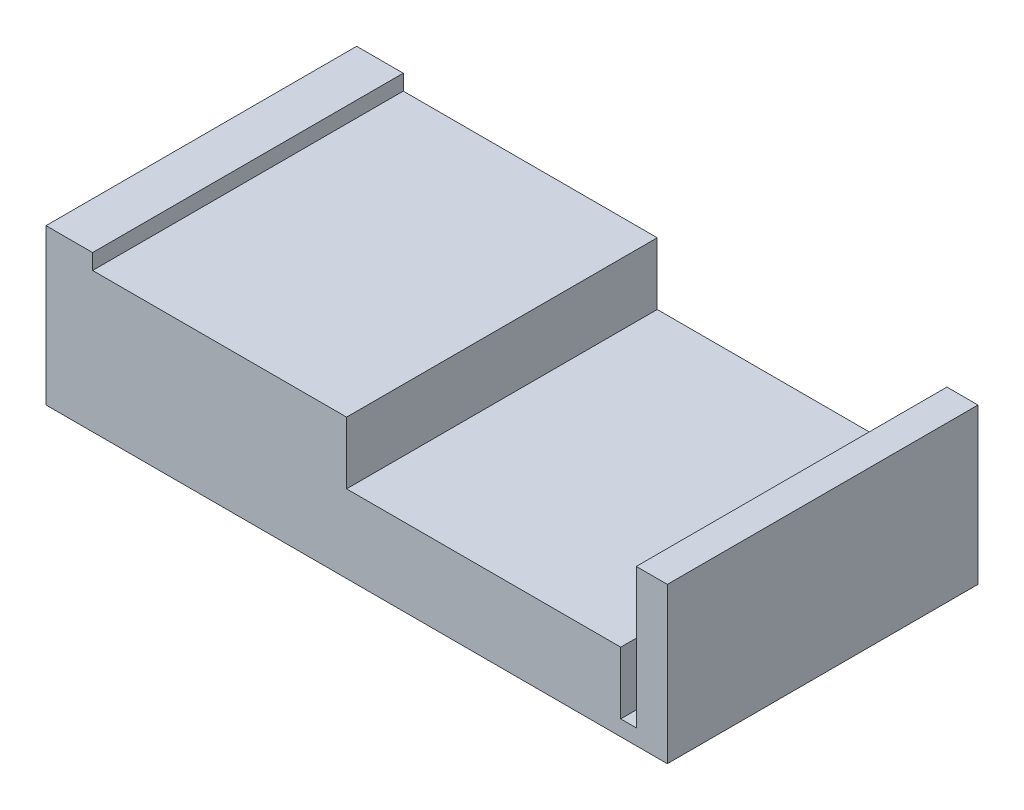
ISO-10303-21;
HEADER;
FILE_DESCRIPTION(('STEP AP214'),'2;1');
FILE_NAME('part.step','',(''),(''),'','','');
FILE_SCHEMA(('AUTOMOTIVE_DESIGN { 1 0 10303 214 1 1 1 1 }'));
ENDSEC;
DATA;
#1=APPLICATION_CONTEXT('core data for automotive mechanical design processes');
#2=APPLICATION_PROTOCOL_DEFINITION('international standard','automotive_design',2000,#1);
#3=PRODUCT_CONTEXT('',#1,'mechanical');
#4=PRODUCT('Part','Part','',(#3));
#5=PRODUCT_RELATED_PRODUCT_CATEGORY('part','',(#4));
#6=PRODUCT_DEFINITION_FORMATION('','',#4);
#7=PRODUCT_DEFINITION_CONTEXT('part definition',#1,'design');
#8=PRODUCT_DEFINITION('design','',#6,#7);
#9=PRODUCT_DEFINITION_SHAPE('','',#8);
#10=(LENGTH_UNIT() NAMED_UNIT(*) SI_UNIT(.MILLI.,.METRE.));
#11=(NAMED_UNIT(*) PLANE_ANGLE_UNIT() SI_UNIT($,.RADIAN.));
#12=(NAMED_UNIT(*) SI_UNIT($,.STERADIAN.) SOLID_ANGLE_UNIT());
#13=UNCERTAINTY_MEASURE_WITH_UNIT(LENGTH_MEASURE(1.E-05),#10,'distance_accuracy_value','');
#14=(GEOMETRIC_REPRESENTATION_CONTEXT(3) GLOBAL_UNCERTAINTY_ASSIGNED_CONTEXT((#13)) GLOBAL_UNIT_ASSIGNED_CONTEXT((#10,
#11,#12)) REPRESENTATION_CONTEXT('',''));
#15=CARTESIAN_POINT('',(0.,0.,0.));
#16=DIRECTION('',(0.,0.,1.));
#17=DIRECTION('',(1.,0.,0.));
#18=AXIS2_PLACEMENT_3D('',#15,#16,#17);
#19=CARTESIAN_POINT('',(0.,50.,0.));
#20=DIRECTION('',(0.,-1.,0.));
#21=DIRECTION('',(0.,0.,-1.));
#22=AXIS2_PLACEMENT_3D('',#19,#20,#21);
#23=PLANE('',#22);
#24=DIRECTION('',(1.,0.,0.));
#25=VECTOR('',#24,1.);
#26=CARTESIAN_POINT('',(0.,50.,0.));
#27=LINE('',#26,#25);
#28=CARTESIAN_POINT('',(0.,50.,0.));
#29=VERTEX_POINT('',#28);
#30=CARTESIAN_POINT('',(15.,50.,0.));
#31=VERTEX_POINT('',#30);
#32=EDGE_CURVE('E88',#29,#31,#27,.T.);
#33=ORIENTED_EDGE('',*,*,#32,.T.);
#34=DIRECTION('',(0.,0.,1.));
#35=VECTOR('',#34,1.);
#36=CARTESIAN_POINT('',(15.,50.,-100.));
#37=LINE('',#36,#35);
#38=CARTESIAN_POINT('',(15.,50.,-100.));
#39=VERTEX_POINT('',#38);
#40=EDGE_CURVE('E179',#39,#31,#37,.T.);
#41=ORIENTED_EDGE('',*,*,#40,.F.);
#42=DIRECTION('',(-1.,0.,0.));
#43=VECTOR('',#42,1.);
#44=CARTESIAN_POINT('',(0.,50.,-100.));
#45=LINE('',#44,#43);
#46=CARTESIAN_POINT('',(0.,50.,-100.));
#47=VERTEX_POINT('',#46);
#48=EDGE_CURVE('E59',#39,#47,#45,.T.);
#49=ORIENTED_EDGE('',*,*,#48,.T.);
#50=DIRECTION('',(0.,0.,1.));
#51=VECTOR('',#50,1.);
#52=CARTESIAN_POINT('',(0.,50.,0.));
#53=LINE('',#52,#51);
#54=EDGE_CURVE('E202',#47,#29,#53,.T.);
#55=ORIENTED_EDGE('',*,*,#54,.T.);
#56=EDGE_LOOP('',(#33,#41,#49,#55));
#57=FACE_BOUND('',#56,.T.);
#58=ADVANCED_FACE('F35',(#57),#23,.F.);
#59=CARTESIAN_POINT('',(0.,50.,0.));
#60=DIRECTION('',(1.,0.,0.));
#61=DIRECTION('',(0.,0.,-1.));
#62=AXIS2_PLACEMENT_3D('',#59,#60,#61);
#63=PLANE('',#62);
#64=DIRECTION('',(0.,0.,1.));
#65=VECTOR('',#64,1.);
#66=CARTESIAN_POINT('',(0.,0.,0.));
#67=LINE('',#66,#65);
#68=CARTESIAN_POINT('',(0.,0.,-100.));
#69=VERTEX_POINT('',#68);
#70=CARTESIAN_POINT('',(0.,0.,0.));
#71=VERTEX_POINT('',#70);
#72=EDGE_CURVE('E200',#69,#71,#67,.T.);
#73=ORIENTED_EDGE('',*,*,#72,.T.);
#74=DIRECTION('',(0.,-1.,0.));
#75=VECTOR('',#74,1.);
#76=CARTESIAN_POINT('',(0.,50.,0.));
#77=LINE('',#76,#75);
#78=EDGE_CURVE('E11',#29,#71,#77,.T.);
#79=ORIENTED_EDGE('',*,*,#78,.F.);
#80=ORIENTED_EDGE('',*,*,#54,.F.);
#81=DIRECTION('',(0.,-1.,0.));
#82=VECTOR('',#81,1.);
#83=CARTESIAN_POINT('',(0.,50.,-100.));
#84=LINE('',#83,#82);
#85=EDGE_CURVE('E210',#47,#69,#84,.T.);
#86=ORIENTED_EDGE('',*,*,#85,.T.);
#87=EDGE_LOOP('',(#73,#79,#80,#86));
#88=FACE_BOUND('',#87,.T.);
#89=ADVANCED_FACE('F37',(#88),#63,.F.);
#90=CARTESIAN_POINT('',(0.,50.,0.));
#91=DIRECTION('',(0.,0.,-1.));
#92=DIRECTION('',(-1.,0.,0.));
#93=AXIS2_PLACEMENT_3D('',#90,#91,#92);
#94=PLANE('',#93);
#95=DIRECTION('',(0.,1.,0.));
#96=VECTOR('',#95,1.);
#97=CARTESIAN_POINT('',(190.,25.,0.));
#98=LINE('',#97,#96);
#99=CARTESIAN_POINT('',(190.,5.,0.));
#100=VERTEX_POINT('',#99);
#101=CARTESIAN_POINT('',(190.,50.,0.));
#102=VERTEX_POINT('',#101);
#103=EDGE_CURVE('E146',#100,#102,#98,.T.);
#104=ORIENTED_EDGE('',*,*,#103,.F.);
#105=DIRECTION('',(1.,0.,0.));
#106=VECTOR('',#105,1.);
#107=CARTESIAN_POINT('',(190.,5.,0.));
#108=LINE('',#107,#106);
#109=CARTESIAN_POINT('',(185.,5.,0.));
#110=VERTEX_POINT('',#109);
#111=EDGE_CURVE('E154',#110,#100,#108,.T.);
#112=ORIENTED_EDGE('',*,*,#111,.F.);
#113=DIRECTION('',(0.,1.,0.));
#114=VECTOR('',#113,1.);
#115=CARTESIAN_POINT('',(185.,5.,0.));
#116=LINE('',#115,#114);
#117=CARTESIAN_POINT('',(185.,25.,0.));
#118=VERTEX_POINT('',#117);
#119=EDGE_CURVE('E165',#110,#118,#116,.T.);
#120=ORIENTED_EDGE('',*,*,#119,.T.);
#121=DIRECTION('',(1.,0.,0.));
#122=VECTOR('',#121,1.);
#123=CARTESIAN_POINT('',(96.7527416806416,25.,0.));
#124=LINE('',#123,#122);
#125=CARTESIAN_POINT('',(96.7527416806416,25.,0.));
#126=VERTEX_POINT('',#125);
#127=EDGE_CURVE('E172',#126,#118,#124,.T.);
#128=ORIENTED_EDGE('',*,*,#127,.F.);
#129=DIRECTION('',(0.,1.,0.));
#130=VECTOR('',#129,1.);
#131=CARTESIAN_POINT('',(96.7527416806416,25.,0.));
#132=LINE('',#131,#130);
#133=CARTESIAN_POINT('',(96.7527416806416,45.,0.));
#134=VERTEX_POINT('',#133);
#135=EDGE_CURVE('E177',#126,#134,#132,.T.);
#136=ORIENTED_EDGE('',*,*,#135,.T.);
#137=DIRECTION('',(1.,0.,0.));
#138=VECTOR('',#137,1.);
#139=CARTESIAN_POINT('',(15.,45.,0.));
#140=LINE('',#139,#138);
#141=CARTESIAN_POINT('',(15.,45.,0.));
#142=VERTEX_POINT('',#141);
#143=EDGE_CURVE('E187',#142,#134,#140,.T.);
#144=ORIENTED_EDGE('',*,*,#143,.F.);
#145=DIRECTION('',(0.,1.,0.));
#146=VECTOR('',#145,1.);
#147=CARTESIAN_POINT('',(15.,45.,0.));
#148=LINE('',#147,#146);
#149=EDGE_CURVE('E196',#142,#31,#148,.T.);
#150=ORIENTED_EDGE('',*,*,#149,.T.);
#151=ORIENTED_EDGE('',*,*,#32,.F.);
#152=ORIENTED_EDGE('',*,*,#78,.T.);
#153=DIRECTION('',(1.,0.,0.));
#154=VECTOR('',#153,1.);
#155=CARTESIAN_POINT('',(0.,0.,0.));
#156=LINE('',#155,#154);
#157=CARTESIAN_POINT('',(200.,0.,0.));
#158=VERTEX_POINT('',#157);
#159=EDGE_CURVE('E213',#71,#158,#156,.T.);
#160=ORIENTED_EDGE('',*,*,#159,.T.);
#161=DIRECTION('',(0.,-1.,0.));
#162=VECTOR('',#161,1.);
#163=CARTESIAN_POINT('',(200.,50.,0.));
#164=LINE('',#163,#162);
#165=CARTESIAN_POINT('',(200.,50.,0.));
#166=VERTEX_POINT('',#165);
#167=EDGE_CURVE('E43',#166,#158,#164,.T.);
#168=ORIENTED_EDGE('',*,*,#167,.F.);
#169=EDGE_CURVE('E204',#102,#166,#27,.T.);
#170=ORIENTED_EDGE('',*,*,#169,.F.);
#171=EDGE_LOOP('',(#104,#112,#120,#128,#136,#144,#150,#151,#152,#160,#168,#170));
#172=FACE_BOUND('',#171,.T.);
#173=ADVANCED_FACE('F245',(#172),#94,.F.);
#174=CARTESIAN_POINT('',(200.,50.,0.));
#175=DIRECTION('',(-1.,0.,0.));
#176=DIRECTION('',(0.,0.,1.));
#177=AXIS2_PLACEMENT_3D('',#174,#175,#176);
#178=PLANE('',#177);
#179=DIRECTION('',(0.,0.,-1.));
#180=VECTOR('',#179,1.);
#181=CARTESIAN_POINT('',(200.,0.,0.));
#182=LINE('',#181,#180);
#183=CARTESIAN_POINT('',(200.,0.,-100.));
#184=VERTEX_POINT('',#183);
#185=EDGE_CURVE('E215',#158,#184,#182,.T.);
#186=ORIENTED_EDGE('',*,*,#185,.T.);
#187=DIRECTION('',(0.,-1.,0.));
#188=VECTOR('',#187,1.);
#189=CARTESIAN_POINT('',(200.,50.,-100.));
#190=LINE('',#189,#188);
#191=CARTESIAN_POINT('',(200.,50.,-100.));
#192=VERTEX_POINT('',#191);
#193=EDGE_CURVE('E219',#192,#184,#190,.T.);
#194=ORIENTED_EDGE('',*,*,#193,.F.);
#195=DIRECTION('',(0.,0.,-1.));
#196=VECTOR('',#195,1.);
#197=CARTESIAN_POINT('',(200.,50.,0.));
#198=LINE('',#197,#196);
#199=EDGE_CURVE('E206',#166,#192,#198,.T.);
#200=ORIENTED_EDGE('',*,*,#199,.F.);
#201=ORIENTED_EDGE('',*,*,#167,.T.);
#202=EDGE_LOOP('',(#186,#194,#200,#201));
#203=FACE_BOUND('',#202,.T.);
#204=ADVANCED_FACE('F225',(#203),#178,.F.);
#205=CARTESIAN_POINT('',(0.,50.,-100.));
#206=DIRECTION('',(0.,0.,1.));
#207=DIRECTION('',(1.,0.,0.));
#208=AXIS2_PLACEMENT_3D('',#205,#206,#207);
#209=PLANE('',#208);
#210=DIRECTION('',(-1.,0.,0.));
#211=VECTOR('',#210,1.);
#212=CARTESIAN_POINT('',(190.,5.,-100.));
#213=LINE('',#212,#211);
#214=CARTESIAN_POINT('',(190.,5.,-100.));
#215=VERTEX_POINT('',#214);
#216=CARTESIAN_POINT('',(185.,5.,-100.));
#217=VERTEX_POINT('',#216);
#218=EDGE_CURVE('E152',#215,#217,#213,.T.);
#219=ORIENTED_EDGE('',*,*,#218,.F.);
#220=DIRECTION('',(0.,1.,0.));
#221=VECTOR('',#220,1.);
#222=CARTESIAN_POINT('',(190.,25.,-100.));
#223=LINE('',#222,#221);
#224=CARTESIAN_POINT('',(190.,50.,-100.));
#225=VERTEX_POINT('',#224);
#226=EDGE_CURVE('E135',#215,#225,#223,.T.);
#227=ORIENTED_EDGE('',*,*,#226,.T.);
#228=EDGE_CURVE('E208',#192,#225,#45,.T.);
#229=ORIENTED_EDGE('',*,*,#228,.F.);
#230=ORIENTED_EDGE('',*,*,#193,.T.);
#231=DIRECTION('',(-1.,0.,0.));
#232=VECTOR('',#231,1.);
#233=CARTESIAN_POINT('',(0.,0.,-100.));
#234=LINE('',#233,#232);
#235=EDGE_CURVE('E81',#184,#69,#234,.T.);
#236=ORIENTED_EDGE('',*,*,#235,.T.);
#237=ORIENTED_EDGE('',*,*,#85,.F.);
#238=ORIENTED_EDGE('',*,*,#48,.F.);
#239=DIRECTION('',(0.,1.,0.));
#240=VECTOR('',#239,1.);
#241=CARTESIAN_POINT('',(15.,45.,-100.));
#242=LINE('',#241,#240);
#243=CARTESIAN_POINT('',(15.,45.,-100.));
#244=VERTEX_POINT('',#243);
#245=EDGE_CURVE('E198',#244,#39,#242,.T.);
#246=ORIENTED_EDGE('',*,*,#245,.F.);
#247=DIRECTION('',(-1.,0.,0.));
#248=VECTOR('',#247,1.);
#249=CARTESIAN_POINT('',(15.,45.,-100.));
#250=LINE('',#249,#248);
#251=CARTESIAN_POINT('',(96.7527416806416,45.,-100.));
#252=VERTEX_POINT('',#251);
#253=EDGE_CURVE('E193',#252,#244,#250,.T.);
#254=ORIENTED_EDGE('',*,*,#253,.F.);
#255=DIRECTION('',(0.,1.,0.));
#256=VECTOR('',#255,1.);
#257=CARTESIAN_POINT('',(96.7527416806416,25.,-100.));
#258=LINE('',#257,#256);
#259=CARTESIAN_POINT('',(96.7527416806416,25.,-100.));
#260=VERTEX_POINT('',#259);
#261=EDGE_CURVE('E145',#260,#252,#258,.T.);
#262=ORIENTED_EDGE('',*,*,#261,.F.);
#263=DIRECTION('',(-1.,0.,0.));
#264=VECTOR('',#263,1.);
#265=CARTESIAN_POINT('',(96.7527416806416,25.,-100.));
#266=LINE('',#265,#264);
#267=CARTESIAN_POINT('',(185.,25.,-100.));
#268=VERTEX_POINT('',#267);
#269=EDGE_CURVE('E175',#268,#260,#266,.T.);
#270=ORIENTED_EDGE('',*,*,#269,.F.);
#271=DIRECTION('',(0.,1.,0.));
#272=VECTOR('',#271,1.);
#273=CARTESIAN_POINT('',(185.,5.,-100.));
#274=LINE('',#273,#272);
#275=EDGE_CURVE('E50',#217,#268,#274,.T.);
#276=ORIENTED_EDGE('',*,*,#275,.F.);
#277=EDGE_LOOP('',(#219,#227,#229,#230,#236,#237,#238,#246,#254,#262,#270,#276));
#278=FACE_BOUND('',#277,.T.);
#279=ADVANCED_FACE('F157',(#278),#209,.F.);
#280=ORIENTED_EDGE('',*,*,#228,.T.);
#281=DIRECTION('',(0.,0.,-1.));
#282=VECTOR('',#281,1.);
#283=CARTESIAN_POINT('',(190.,50.,-100.));
#284=LINE('',#283,#282);
#285=EDGE_CURVE('E141',#102,#225,#284,.T.);
#286=ORIENTED_EDGE('',*,*,#285,.F.);
#287=ORIENTED_EDGE('',*,*,#169,.T.);
#288=ORIENTED_EDGE('',*,*,#199,.T.);
#289=EDGE_LOOP('',(#280,#286,#287,#288));
#290=FACE_BOUND('',#289,.T.);
#291=ADVANCED_FACE('F241',(#290),#23,.F.);
#292=CARTESIAN_POINT('',(0.,0.,0.));
#293=DIRECTION('',(0.,-1.,0.));
#294=DIRECTION('',(0.,0.,-1.));
#295=AXIS2_PLACEMENT_3D('',#292,#293,#294);
#296=PLANE('',#295);
#297=ORIENTED_EDGE('',*,*,#72,.F.);
#298=ORIENTED_EDGE('',*,*,#235,.F.);
#299=ORIENTED_EDGE('',*,*,#185,.F.);
#300=ORIENTED_EDGE('',*,*,#159,.F.);
#301=EDGE_LOOP('',(#297,#298,#299,#300));
#302=FACE_BOUND('',#301,.T.);
#303=ADVANCED_FACE('F230',(#302),#296,.T.);
#304=CARTESIAN_POINT('',(15.,45.,-100.));
#305=DIRECTION('',(-1.,0.,0.));
#306=DIRECTION('',(0.,0.,1.));
#307=AXIS2_PLACEMENT_3D('',#304,#305,#306);
#308=PLANE('',#307);
#309=ORIENTED_EDGE('',*,*,#40,.T.);
#310=ORIENTED_EDGE('',*,*,#149,.F.);
#311=DIRECTION('',(0.,0.,1.));
#312=VECTOR('',#311,1.);
#313=CARTESIAN_POINT('',(15.,45.,-100.));
#314=LINE('',#313,#312);
#315=EDGE_CURVE('E184',#244,#142,#314,.T.);
#316=ORIENTED_EDGE('',*,*,#315,.F.);
#317=ORIENTED_EDGE('',*,*,#245,.T.);
#318=EDGE_LOOP('',(#309,#310,#316,#317));
#319=FACE_BOUND('',#318,.T.);
#320=ADVANCED_FACE('F238',(#319),#308,.F.);
#321=CARTESIAN_POINT('',(0.,45.,0.));
#322=DIRECTION('',(0.,1.,0.));
#323=DIRECTION('',(0.,0.,1.));
#324=AXIS2_PLACEMENT_3D('',#321,#322,#323);
#325=PLANE('',#324);
#326=ORIENTED_EDGE('',*,*,#315,.T.);
#327=ORIENTED_EDGE('',*,*,#143,.T.);
#328=DIRECTION('',(0.,0.,-1.));
#329=VECTOR('',#328,1.);
#330=CARTESIAN_POINT('',(96.7527416806416,45.,-100.));
#331=LINE('',#330,#329);
#332=EDGE_CURVE('E190',#134,#252,#331,.T.);
#333=ORIENTED_EDGE('',*,*,#332,.T.);
#334=ORIENTED_EDGE('',*,*,#253,.T.);
#335=EDGE_LOOP('',(#326,#327,#333,#334));
#336=FACE_BOUND('',#335,.T.);
#337=ADVANCED_FACE('F264',(#336),#325,.T.);
#338=CARTESIAN_POINT('',(96.7527416806416,25.,-100.));
#339=DIRECTION('',(-1.,0.,0.));
#340=DIRECTION('',(0.,0.,1.));
#341=AXIS2_PLACEMENT_3D('',#338,#339,#340);
#342=PLANE('',#341);
#343=ORIENTED_EDGE('',*,*,#332,.F.);
#344=ORIENTED_EDGE('',*,*,#135,.F.);
#345=DIRECTION('',(0.,0.,1.));
#346=VECTOR('',#345,1.);
#347=CARTESIAN_POINT('',(96.7527416806416,25.,-100.));
#348=LINE('',#347,#346);
#349=EDGE_CURVE('E169',#260,#126,#348,.T.);
#350=ORIENTED_EDGE('',*,*,#349,.F.);
#351=ORIENTED_EDGE('',*,*,#261,.T.);
#352=EDGE_LOOP('',(#343,#344,#350,#351));
#353=FACE_BOUND('',#352,.T.);
#354=ADVANCED_FACE('F261',(#353),#342,.F.);
#355=CARTESIAN_POINT('',(190.,25.,-100.));
#356=DIRECTION('',(1.,0.,0.));
#357=DIRECTION('',(0.,0.,-1.));
#358=AXIS2_PLACEMENT_3D('',#355,#356,#357);
#359=PLANE('',#358);
#360=ORIENTED_EDGE('',*,*,#285,.T.);
#361=ORIENTED_EDGE('',*,*,#226,.F.);
#362=DIRECTION('',(0.,0.,-1.));
#363=VECTOR('',#362,1.);
#364=CARTESIAN_POINT('',(190.,5.,-100.));
#365=LINE('',#364,#363);
#366=EDGE_CURVE('E138',#100,#215,#365,.T.);
#367=ORIENTED_EDGE('',*,*,#366,.F.);
#368=ORIENTED_EDGE('',*,*,#103,.T.);
#369=EDGE_LOOP('',(#360,#361,#367,#368));
#370=FACE_BOUND('',#369,.T.);
#371=ADVANCED_FACE('F137',(#370),#359,.F.);
#372=CARTESIAN_POINT('',(0.,25.,0.));
#373=DIRECTION('',(0.,1.,0.));
#374=DIRECTION('',(0.,0.,1.));
#375=AXIS2_PLACEMENT_3D('',#372,#373,#374);
#376=PLANE('',#375);
#377=DIRECTION('',(0.,0.,1.));
#378=VECTOR('',#377,1.);
#379=CARTESIAN_POINT('',(185.,25.,-100.));
#380=LINE('',#379,#378);
#381=EDGE_CURVE('E155',#268,#118,#380,.T.);
#382=ORIENTED_EDGE('',*,*,#381,.F.);
#383=ORIENTED_EDGE('',*,*,#269,.T.);
#384=ORIENTED_EDGE('',*,*,#349,.T.);
#385=ORIENTED_EDGE('',*,*,#127,.T.);
#386=EDGE_LOOP('',(#382,#383,#384,#385));
#387=FACE_BOUND('',#386,.T.);
#388=ADVANCED_FACE('F258',(#387),#376,.T.);
#389=CARTESIAN_POINT('',(185.,5.,-100.));
#390=DIRECTION('',(-1.,0.,0.));
#391=DIRECTION('',(0.,0.,1.));
#392=AXIS2_PLACEMENT_3D('',#389,#390,#391);
#393=PLANE('',#392);
#394=ORIENTED_EDGE('',*,*,#381,.T.);
#395=ORIENTED_EDGE('',*,*,#119,.F.);
#396=DIRECTION('',(0.,0.,1.));
#397=VECTOR('',#396,1.);
#398=CARTESIAN_POINT('',(185.,5.,-100.));
#399=LINE('',#398,#397);
#400=EDGE_CURVE('E159',#217,#110,#399,.T.);
#401=ORIENTED_EDGE('',*,*,#400,.F.);
#402=ORIENTED_EDGE('',*,*,#275,.T.);
#403=EDGE_LOOP('',(#394,#395,#401,#402));
#404=FACE_BOUND('',#403,.T.);
#405=ADVANCED_FACE('F277',(#404),#393,.F.);
#406=CARTESIAN_POINT('',(0.,5.,0.));
#407=DIRECTION('',(0.,-1.,0.));
#408=DIRECTION('',(0.,0.,-1.));
#409=AXIS2_PLACEMENT_3D('',#406,#407,#408);
#410=PLANE('',#409);
#411=ORIENTED_EDGE('',*,*,#366,.T.);
#412=ORIENTED_EDGE('',*,*,#218,.T.);
#413=ORIENTED_EDGE('',*,*,#400,.T.);
#414=ORIENTED_EDGE('',*,*,#111,.T.);
#415=EDGE_LOOP('',(#411,#412,#413,#414));
#416=FACE_BOUND('',#415,.T.);
#417=ADVANCED_FACE('F150',(#416),#410,.F.);
#418=CLOSED_SHELL('',(#58,#89,#173,#204,#279,#291,#303,#320,#337,#354,#371,#388,#405,#417));
#419=MANIFOLD_SOLID_BREP('B2',#418);
#420=ADVANCED_BREP_SHAPE_REPRESENTATION('',(#18,#419),#14);
#421=SHAPE_DEFINITION_REPRESENTATION(#9,#420);
ENDSEC;
END-ISO-10303-21;
